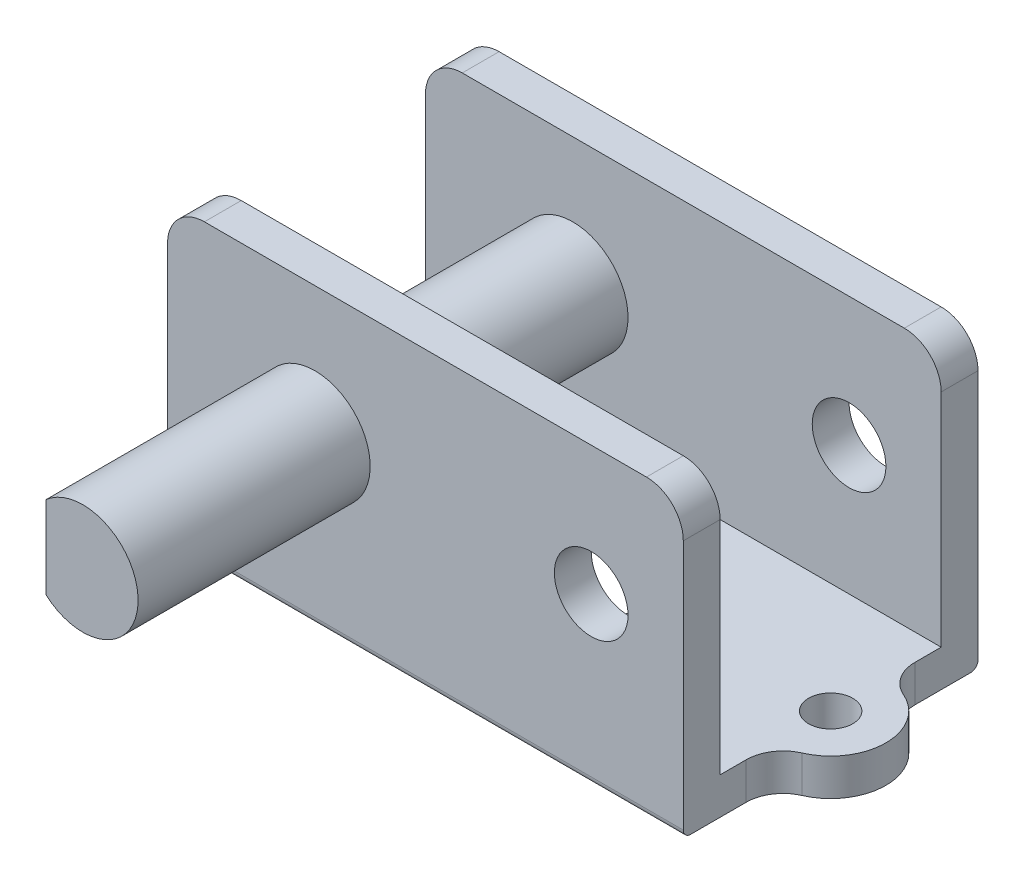
ISO-10303-21;
HEADER;
FILE_DESCRIPTION(('STEP AP214'),'2;1');
FILE_NAME('part.step','',(''),(''),'','','');
FILE_SCHEMA(('AUTOMOTIVE_DESIGN { 1 0 10303 214 1 1 1 1 }'));
ENDSEC;
DATA;
#1=APPLICATION_CONTEXT('core data for automotive mechanical design processes');
#2=APPLICATION_PROTOCOL_DEFINITION('international standard','automotive_design',2000,#1);
#3=PRODUCT_CONTEXT('',#1,'mechanical');
#4=PRODUCT('Part','Part','',(#3));
#5=PRODUCT_RELATED_PRODUCT_CATEGORY('part','',(#4));
#6=PRODUCT_DEFINITION_FORMATION('','',#4);
#7=PRODUCT_DEFINITION_CONTEXT('part definition',#1,'design');
#8=PRODUCT_DEFINITION('design','',#6,#7);
#9=PRODUCT_DEFINITION_SHAPE('','',#8);
#10=(LENGTH_UNIT() NAMED_UNIT(*) SI_UNIT(.MILLI.,.METRE.));
#11=(NAMED_UNIT(*) PLANE_ANGLE_UNIT() SI_UNIT($,.RADIAN.));
#12=(NAMED_UNIT(*) SI_UNIT($,.STERADIAN.) SOLID_ANGLE_UNIT());
#13=UNCERTAINTY_MEASURE_WITH_UNIT(LENGTH_MEASURE(1.E-05),#10,'distance_accuracy_value','');
#14=(GEOMETRIC_REPRESENTATION_CONTEXT(3) GLOBAL_UNCERTAINTY_ASSIGNED_CONTEXT((#13)) GLOBAL_UNIT_ASSIGNED_CONTEXT((#10,
#11,#12)) REPRESENTATION_CONTEXT('',''));
#15=CARTESIAN_POINT('',(0.,0.,0.));
#16=DIRECTION('',(0.,0.,1.));
#17=DIRECTION('',(1.,0.,0.));
#18=AXIS2_PLACEMENT_3D('',#15,#16,#17);
#19=CARTESIAN_POINT('',(-3.,4.5,-3.));
#20=DIRECTION('',(0.,0.,1.));
#21=DIRECTION('',(1.,0.,0.));
#22=AXIS2_PLACEMENT_3D('',#19,#20,#21);
#23=CYLINDRICAL_SURFACE('',#22,1.5);
#24=CARTESIAN_POINT('',(-3.,4.5,4.));
#25=DIRECTION('',(0.,0.,-1.));
#26=DIRECTION('',(-1.,0.,0.));
#27=AXIS2_PLACEMENT_3D('',#24,#25,#26);
#28=CIRCLE('',#27,1.5);
#29=CARTESIAN_POINT('',(-4.5,4.5,4.));
#30=VERTEX_POINT('',#29);
#31=EDGE_CURVE('E233',#30,#30,#28,.T.);
#32=ORIENTED_EDGE('',*,*,#31,.F.);
#33=EDGE_LOOP('',(#32));
#34=FACE_BOUND('',#33,.T.);
#35=DIRECTION('',(0.,0.,1.));
#36=VECTOR('',#35,1.);
#37=CARTESIAN_POINT('',(-4.,5.6180339887499,-3.));
#38=LINE('',#37,#36);
#39=CARTESIAN_POINT('',(-4.,5.6180339887499,10.3));
#40=VERTEX_POINT('',#39);
#41=CARTESIAN_POINT('',(-4.,5.6180339887499,5.));
#42=VERTEX_POINT('',#41);
#43=EDGE_CURVE('E217',#40,#42,#38,.F.);
#44=ORIENTED_EDGE('',*,*,#43,.F.);
#45=CARTESIAN_POINT('',(-3.,4.5,10.3));
#46=DIRECTION('',(0.,0.,1.));
#47=DIRECTION('',(1.,0.,0.));
#48=AXIS2_PLACEMENT_3D('',#45,#46,#47);
#49=CIRCLE('',#48,1.5);
#50=CARTESIAN_POINT('',(-4.,3.3819660112501,10.3));
#51=VERTEX_POINT('',#50);
#52=EDGE_CURVE('E64',#40,#51,#49,.F.);
#53=ORIENTED_EDGE('',*,*,#52,.T.);
#54=DIRECTION('',(0.,0.,1.));
#55=VECTOR('',#54,1.);
#56=CARTESIAN_POINT('',(-4.,3.3819660112501,-3.));
#57=LINE('',#56,#55);
#58=CARTESIAN_POINT('',(-4.,3.3819660112501,5.));
#59=VERTEX_POINT('',#58);
#60=EDGE_CURVE('E216',#59,#51,#57,.T.);
#61=ORIENTED_EDGE('',*,*,#60,.F.);
#62=CARTESIAN_POINT('',(-3.,4.5,5.));
#63=DIRECTION('',(0.,0.,1.));
#64=DIRECTION('',(1.,0.,0.));
#65=AXIS2_PLACEMENT_3D('',#62,#63,#64);
#66=CIRCLE('',#65,1.5);
#67=EDGE_CURVE('E363',#59,#42,#66,.F.);
#68=ORIENTED_EDGE('',*,*,#67,.T.);
#69=EDGE_LOOP('',(#44,#53,#61,#68));
#70=FACE_BOUND('',#69,.T.);
#71=ADVANCED_FACE('F51',(#34,#70),#23,.T.);
#72=CARTESIAN_POINT('',(-4.,0.,5.));
#73=DIRECTION('',(1.,0.,0.));
#74=DIRECTION('',(0.,0.,-1.));
#75=AXIS2_PLACEMENT_3D('',#72,#73,#74);
#76=PLANE('',#75);
#77=DIRECTION('',(0.,-1.,0.));
#78=VECTOR('',#77,1.);
#79=CARTESIAN_POINT('',(-4.,0.,10.3));
#80=LINE('',#79,#78);
#81=EDGE_CURVE('E13',#40,#51,#80,.T.);
#82=ORIENTED_EDGE('',*,*,#81,.F.);
#83=ORIENTED_EDGE('',*,*,#43,.T.);
#84=DIRECTION('',(0.,1.,0.));
#85=VECTOR('',#84,1.);
#86=CARTESIAN_POINT('',(-4.,0.,5.));
#87=LINE('',#86,#85);
#88=EDGE_CURVE('E223',#59,#42,#87,.T.);
#89=ORIENTED_EDGE('',*,*,#88,.F.);
#90=ORIENTED_EDGE('',*,*,#60,.T.);
#91=EDGE_LOOP('',(#82,#83,#89,#90));
#92=FACE_BOUND('',#91,.T.);
#93=ADVANCED_FACE('F221',(#92),#76,.F.);
#94=CARTESIAN_POINT('',(-7.,0.,4.));
#95=DIRECTION('',(1.,0.,0.));
#96=DIRECTION('',(0.,0.,-1.));
#97=AXIS2_PLACEMENT_3D('',#94,#95,#96);
#98=PLANE('',#97);
#99=DIRECTION('',(0.,0.,1.));
#100=VECTOR('',#99,1.);
#101=CARTESIAN_POINT('',(-7.,1.,0.));
#102=LINE('',#101,#100);
#103=CARTESIAN_POINT('',(-7.,1.,2.29128784747792));
#104=VERTEX_POINT('',#103);
#105=CARTESIAN_POINT('',(-7.,1.,3.));
#106=VERTEX_POINT('',#105);
#107=EDGE_CURVE('E249',#104,#106,#102,.T.);
#108=ORIENTED_EDGE('',*,*,#107,.F.);
#109=DIRECTION('',(0.,-1.,0.));
#110=VECTOR('',#109,1.);
#111=CARTESIAN_POINT('',(-7.,0.,2.29128784747792));
#112=LINE('',#111,#110);
#113=CARTESIAN_POINT('',(-7.,0.,2.29128784747792));
#114=VERTEX_POINT('',#113);
#115=EDGE_CURVE('E382',#104,#114,#112,.T.);
#116=ORIENTED_EDGE('',*,*,#115,.T.);
#117=DIRECTION('',(0.,0.,-1.));
#118=VECTOR('',#117,1.);
#119=CARTESIAN_POINT('',(-7.,0.,4.));
#120=LINE('',#119,#118);
#121=CARTESIAN_POINT('',(-7.,0.,3.8));
#122=VERTEX_POINT('',#121);
#123=EDGE_CURVE('E292',#122,#114,#120,.T.);
#124=ORIENTED_EDGE('',*,*,#123,.F.);
#125=CARTESIAN_POINT('',(-7.,0.199999999999999,3.8));
#126=DIRECTION('',(1.,0.,0.));
#127=DIRECTION('',(0.,0.,-1.));
#128=AXIS2_PLACEMENT_3D('',#125,#126,#127);
#129=CIRCLE('',#128,0.2);
#130=CARTESIAN_POINT('',(-7.,0.199999999999999,4.));
#131=VERTEX_POINT('',#130);
#132=EDGE_CURVE('E315',#122,#131,#129,.F.);
#133=ORIENTED_EDGE('',*,*,#132,.T.);
#134=DIRECTION('',(0.,-1.,0.));
#135=VECTOR('',#134,1.);
#136=CARTESIAN_POINT('',(-7.,0.,4.));
#137=LINE('',#136,#135);
#138=CARTESIAN_POINT('',(-7.,7.,4.));
#139=VERTEX_POINT('',#138);
#140=EDGE_CURVE('E283',#139,#131,#137,.T.);
#141=ORIENTED_EDGE('',*,*,#140,.F.);
#142=DIRECTION('',(0.,0.,-1.));
#143=VECTOR('',#142,1.);
#144=CARTESIAN_POINT('',(-7.,7.,4.));
#145=LINE('',#144,#143);
#146=CARTESIAN_POINT('',(-7.,7.,3.));
#147=VERTEX_POINT('',#146);
#148=EDGE_CURVE('E354',#139,#147,#145,.T.);
#149=ORIENTED_EDGE('',*,*,#148,.T.);
#150=DIRECTION('',(0.,1.,0.));
#151=VECTOR('',#150,1.);
#152=CARTESIAN_POINT('',(-7.,0.,3.));
#153=LINE('',#152,#151);
#154=EDGE_CURVE('E246',#106,#147,#153,.T.);
#155=ORIENTED_EDGE('',*,*,#154,.F.);
#156=EDGE_LOOP('',(#108,#116,#124,#133,#141,#149,#155));
#157=FACE_BOUND('',#156,.T.);
#158=ADVANCED_FACE('F406',(#157),#98,.F.);
#159=CARTESIAN_POINT('',(7.,8.,4.));
#160=DIRECTION('',(-1.,0.,0.));
#161=DIRECTION('',(0.,-1.,0.));
#162=AXIS2_PLACEMENT_3D('',#159,#160,#161);
#163=PLANE('',#162);
#164=DIRECTION('',(0.,0.,1.));
#165=VECTOR('',#164,1.);
#166=CARTESIAN_POINT('',(7.,1.,0.));
#167=LINE('',#166,#165);
#168=CARTESIAN_POINT('',(7.,1.,-3.));
#169=VERTEX_POINT('',#168);
#170=CARTESIAN_POINT('',(7.,1.,-2.29128784747792));
#171=VERTEX_POINT('',#170);
#172=EDGE_CURVE('E240',#169,#171,#167,.T.);
#173=ORIENTED_EDGE('',*,*,#172,.T.);
#174=DIRECTION('',(0.,1.,0.));
#175=VECTOR('',#174,1.);
#176=CARTESIAN_POINT('',(7.,0.,-2.29128784747792));
#177=LINE('',#176,#175);
#178=CARTESIAN_POINT('',(7.,0.,-2.29128784747792));
#179=VERTEX_POINT('',#178);
#180=EDGE_CURVE('E371',#171,#179,#177,.F.);
#181=ORIENTED_EDGE('',*,*,#180,.T.);
#182=DIRECTION('',(0.,0.,-1.));
#183=VECTOR('',#182,1.);
#184=CARTESIAN_POINT('',(7.,0.,4.));
#185=LINE('',#184,#183);
#186=CARTESIAN_POINT('',(7.,0.,-3.8));
#187=VERTEX_POINT('',#186);
#188=EDGE_CURVE('E295',#179,#187,#185,.T.);
#189=ORIENTED_EDGE('',*,*,#188,.T.);
#190=CARTESIAN_POINT('',(7.,0.200000000000001,-3.8));
#191=DIRECTION('',(-1.,0.,0.));
#192=DIRECTION('',(0.,-1.,0.));
#193=AXIS2_PLACEMENT_3D('',#190,#191,#192);
#194=CIRCLE('',#193,0.2);
#195=CARTESIAN_POINT('',(7.,0.200000000000001,-4.));
#196=VERTEX_POINT('',#195);
#197=EDGE_CURVE('E310',#187,#196,#194,.F.);
#198=ORIENTED_EDGE('',*,*,#197,.T.);
#199=DIRECTION('',(0.,1.,0.));
#200=VECTOR('',#199,1.);
#201=CARTESIAN_POINT('',(7.,8.,-4.));
#202=LINE('',#201,#200);
#203=CARTESIAN_POINT('',(7.,7.,-4.));
#204=VERTEX_POINT('',#203);
#205=EDGE_CURVE('E275',#196,#204,#202,.T.);
#206=ORIENTED_EDGE('',*,*,#205,.T.);
#207=DIRECTION('',(0.,0.,-1.));
#208=VECTOR('',#207,1.);
#209=CARTESIAN_POINT('',(7.,7.,4.));
#210=LINE('',#209,#208);
#211=CARTESIAN_POINT('',(7.,7.,-3.));
#212=VERTEX_POINT('',#211);
#213=EDGE_CURVE('E335',#204,#212,#210,.F.);
#214=ORIENTED_EDGE('',*,*,#213,.T.);
#215=DIRECTION('',(0.,1.,0.));
#216=VECTOR('',#215,1.);
#217=CARTESIAN_POINT('',(7.,0.,-3.));
#218=LINE('',#217,#216);
#219=EDGE_CURVE('E243',#169,#212,#218,.T.);
#220=ORIENTED_EDGE('',*,*,#219,.F.);
#221=EDGE_LOOP('',(#173,#181,#189,#198,#206,#214,#220));
#222=FACE_BOUND('',#221,.T.);
#223=ADVANCED_FACE('F483',(#222),#163,.F.);
#224=CARTESIAN_POINT('',(7.,0.,3.8));
#225=VERTEX_POINT('',#224);
#226=CARTESIAN_POINT('',(7.,0.,2.29128784747792));
#227=VERTEX_POINT('',#226);
#228=EDGE_CURVE('E296',#225,#227,#185,.T.);
#229=ORIENTED_EDGE('',*,*,#228,.T.);
#230=DIRECTION('',(0.,1.,0.));
#231=VECTOR('',#230,1.);
#232=CARTESIAN_POINT('',(7.,1.,2.29128784747792));
#233=LINE('',#232,#231);
#234=CARTESIAN_POINT('',(7.,1.,2.29128784747792));
#235=VERTEX_POINT('',#234);
#236=EDGE_CURVE('E373',#227,#235,#233,.T.);
#237=ORIENTED_EDGE('',*,*,#236,.T.);
#238=CARTESIAN_POINT('',(7.,1.,3.));
#239=VERTEX_POINT('',#238);
#240=EDGE_CURVE('E239',#235,#239,#167,.T.);
#241=ORIENTED_EDGE('',*,*,#240,.T.);
#242=DIRECTION('',(0.,1.,0.));
#243=VECTOR('',#242,1.);
#244=CARTESIAN_POINT('',(7.,0.,3.));
#245=LINE('',#244,#243);
#246=CARTESIAN_POINT('',(7.,7.,3.));
#247=VERTEX_POINT('',#246);
#248=EDGE_CURVE('E236',#239,#247,#245,.T.);
#249=ORIENTED_EDGE('',*,*,#248,.T.);
#250=DIRECTION('',(0.,0.,-1.));
#251=VECTOR('',#250,1.);
#252=CARTESIAN_POINT('',(7.,7.,4.));
#253=LINE('',#252,#251);
#254=CARTESIAN_POINT('',(7.,7.,4.));
#255=VERTEX_POINT('',#254);
#256=EDGE_CURVE('E333',#247,#255,#253,.F.);
#257=ORIENTED_EDGE('',*,*,#256,.T.);
#258=DIRECTION('',(0.,1.,0.));
#259=VECTOR('',#258,1.);
#260=CARTESIAN_POINT('',(7.,8.,4.));
#261=LINE('',#260,#259);
#262=CARTESIAN_POINT('',(7.,0.200000000000001,4.));
#263=VERTEX_POINT('',#262);
#264=EDGE_CURVE('E276',#263,#255,#261,.T.);
#265=ORIENTED_EDGE('',*,*,#264,.F.);
#266=CARTESIAN_POINT('',(7.,0.200000000000001,3.8));
#267=DIRECTION('',(-1.,0.,0.));
#268=DIRECTION('',(0.,-1.,0.));
#269=AXIS2_PLACEMENT_3D('',#266,#267,#268);
#270=CIRCLE('',#269,0.2);
#271=EDGE_CURVE('E308',#263,#225,#270,.F.);
#272=ORIENTED_EDGE('',*,*,#271,.T.);
#273=EDGE_LOOP('',(#229,#237,#241,#249,#257,#265,#272));
#274=FACE_BOUND('',#273,.T.);
#275=ADVANCED_FACE('F743',(#274),#163,.F.);
#276=CARTESIAN_POINT('',(-7.,8.,4.));
#277=DIRECTION('',(0.,-1.,0.));
#278=DIRECTION('',(0.,0.,-1.));
#279=AXIS2_PLACEMENT_3D('',#276,#277,#278);
#280=PLANE('',#279);
#281=DIRECTION('',(-1.,0.,0.));
#282=VECTOR('',#281,1.);
#283=CARTESIAN_POINT('',(-7.,8.,4.));
#284=LINE('',#283,#282);
#285=CARTESIAN_POINT('',(5.99999999999999,8.,4.));
#286=VERTEX_POINT('',#285);
#287=CARTESIAN_POINT('',(-6.,8.,4.));
#288=VERTEX_POINT('',#287);
#289=EDGE_CURVE('E279',#286,#288,#284,.T.);
#290=ORIENTED_EDGE('',*,*,#289,.F.);
#291=DIRECTION('',(0.,0.,-1.));
#292=VECTOR('',#291,1.);
#293=CARTESIAN_POINT('',(6.,8.,4.));
#294=LINE('',#293,#292);
#295=CARTESIAN_POINT('',(6.,8.,3.));
#296=VERTEX_POINT('',#295);
#297=EDGE_CURVE('E343',#286,#296,#294,.T.);
#298=ORIENTED_EDGE('',*,*,#297,.T.);
#299=DIRECTION('',(1.,0.,0.));
#300=VECTOR('',#299,1.);
#301=CARTESIAN_POINT('',(-7.,8.,3.));
#302=LINE('',#301,#300);
#303=CARTESIAN_POINT('',(-6.,8.,3.));
#304=VERTEX_POINT('',#303);
#305=EDGE_CURVE('E262',#304,#296,#302,.T.);
#306=ORIENTED_EDGE('',*,*,#305,.F.);
#307=DIRECTION('',(0.,0.,-1.));
#308=VECTOR('',#307,1.);
#309=CARTESIAN_POINT('',(-6.,8.,4.));
#310=LINE('',#309,#308);
#311=EDGE_CURVE('E341',#304,#288,#310,.F.);
#312=ORIENTED_EDGE('',*,*,#311,.T.);
#313=EDGE_LOOP('',(#290,#298,#306,#312));
#314=FACE_BOUND('',#313,.T.);
#315=ADVANCED_FACE('F750',(#314),#280,.F.);
#316=CARTESIAN_POINT('',(4.5,4.5,-4.));
#317=DIRECTION('',(0.,0.,1.));
#318=DIRECTION('',(1.,0.,0.));
#319=AXIS2_PLACEMENT_3D('',#316,#317,#318);
#320=CYLINDRICAL_SURFACE('',#319,1.);
#321=CARTESIAN_POINT('',(4.5,4.5,4.));
#322=DIRECTION('',(0.,0.,1.));
#323=DIRECTION('',(1.,0.,0.));
#324=AXIS2_PLACEMENT_3D('',#321,#322,#323);
#325=CIRCLE('',#324,1.);
#326=CARTESIAN_POINT('',(5.5,4.5,4.));
#327=VERTEX_POINT('',#326);
#328=EDGE_CURVE('E269',#327,#327,#325,.T.);
#329=ORIENTED_EDGE('',*,*,#328,.T.);
#330=EDGE_LOOP('',(#329));
#331=FACE_BOUND('',#330,.T.);
#332=CARTESIAN_POINT('',(4.5,4.5,3.));
#333=DIRECTION('',(0.,0.,-1.));
#334=DIRECTION('',(-1.,0.,0.));
#335=AXIS2_PLACEMENT_3D('',#332,#333,#334);
#336=CIRCLE('',#335,1.);
#337=CARTESIAN_POINT('',(3.5,4.5,3.));
#338=VERTEX_POINT('',#337);
#339=EDGE_CURVE('E259',#338,#338,#336,.F.);
#340=ORIENTED_EDGE('',*,*,#339,.F.);
#341=EDGE_LOOP('',(#340));
#342=FACE_BOUND('',#341,.T.);
#343=ADVANCED_FACE('F767',(#331,#342),#320,.F.);
#344=DIRECTION('',(1.,0.,0.));
#345=VECTOR('',#344,1.);
#346=CARTESIAN_POINT('',(-7.,8.,-3.));
#347=LINE('',#346,#345);
#348=CARTESIAN_POINT('',(-6.,8.,-3.));
#349=VERTEX_POINT('',#348);
#350=CARTESIAN_POINT('',(6.,8.,-3.));
#351=VERTEX_POINT('',#350);
#352=EDGE_CURVE('E266',#349,#351,#347,.T.);
#353=ORIENTED_EDGE('',*,*,#352,.T.);
#354=DIRECTION('',(0.,0.,-1.));
#355=VECTOR('',#354,1.);
#356=CARTESIAN_POINT('',(6.,8.,4.));
#357=LINE('',#356,#355);
#358=CARTESIAN_POINT('',(5.99999999999999,8.,-4.));
#359=VERTEX_POINT('',#358);
#360=EDGE_CURVE('E326',#351,#359,#357,.T.);
#361=ORIENTED_EDGE('',*,*,#360,.T.);
#362=DIRECTION('',(-1.,0.,0.));
#363=VECTOR('',#362,1.);
#364=CARTESIAN_POINT('',(-7.,8.,-4.));
#365=LINE('',#364,#363);
#366=CARTESIAN_POINT('',(-6.,8.,-4.));
#367=VERTEX_POINT('',#366);
#368=EDGE_CURVE('E288',#359,#367,#365,.T.);
#369=ORIENTED_EDGE('',*,*,#368,.T.);
#370=DIRECTION('',(0.,0.,-1.));
#371=VECTOR('',#370,1.);
#372=CARTESIAN_POINT('',(-6.,8.,4.));
#373=LINE('',#372,#371);
#374=EDGE_CURVE('E324',#367,#349,#373,.F.);
#375=ORIENTED_EDGE('',*,*,#374,.T.);
#376=EDGE_LOOP('',(#353,#361,#369,#375));
#377=FACE_BOUND('',#376,.T.);
#378=ADVANCED_FACE('F467',(#377),#280,.F.);
#379=CARTESIAN_POINT('',(-7.,0.,-2.29128784747792));
#380=VERTEX_POINT('',#379);
#381=CARTESIAN_POINT('',(-7.,0.,-3.8));
#382=VERTEX_POINT('',#381);
#383=EDGE_CURVE('E285',#380,#382,#120,.T.);
#384=ORIENTED_EDGE('',*,*,#383,.F.);
#385=DIRECTION('',(0.,-1.,0.));
#386=VECTOR('',#385,1.);
#387=CARTESIAN_POINT('',(-7.,0.,-2.29128784747792));
#388=LINE('',#387,#386);
#389=CARTESIAN_POINT('',(-7.,1.,-2.29128784747792));
#390=VERTEX_POINT('',#389);
#391=EDGE_CURVE('E375',#380,#390,#388,.F.);
#392=ORIENTED_EDGE('',*,*,#391,.T.);
#393=CARTESIAN_POINT('',(-7.,1.,-3.));
#394=VERTEX_POINT('',#393);
#395=EDGE_CURVE('E250',#394,#390,#102,.T.);
#396=ORIENTED_EDGE('',*,*,#395,.F.);
#397=DIRECTION('',(0.,1.,0.));
#398=VECTOR('',#397,1.);
#399=CARTESIAN_POINT('',(-7.,0.,-3.));
#400=LINE('',#399,#398);
#401=CARTESIAN_POINT('',(-7.,7.,-3.));
#402=VERTEX_POINT('',#401);
#403=EDGE_CURVE('E253',#394,#402,#400,.T.);
#404=ORIENTED_EDGE('',*,*,#403,.T.);
#405=DIRECTION('',(0.,0.,-1.));
#406=VECTOR('',#405,1.);
#407=CARTESIAN_POINT('',(-7.,7.,4.));
#408=LINE('',#407,#406);
#409=CARTESIAN_POINT('',(-7.,7.,-4.));
#410=VERTEX_POINT('',#409);
#411=EDGE_CURVE('E357',#402,#410,#408,.T.);
#412=ORIENTED_EDGE('',*,*,#411,.T.);
#413=DIRECTION('',(0.,-1.,0.));
#414=VECTOR('',#413,1.);
#415=CARTESIAN_POINT('',(-7.,0.,-4.));
#416=LINE('',#415,#414);
#417=CARTESIAN_POINT('',(-7.,0.199999999999999,-4.));
#418=VERTEX_POINT('',#417);
#419=EDGE_CURVE('E280',#410,#418,#416,.T.);
#420=ORIENTED_EDGE('',*,*,#419,.T.);
#421=CARTESIAN_POINT('',(-7.,0.199999999999999,-3.8));
#422=DIRECTION('',(1.,0.,0.));
#423=DIRECTION('',(0.,0.,-1.));
#424=AXIS2_PLACEMENT_3D('',#421,#422,#423);
#425=CIRCLE('',#424,0.2);
#426=EDGE_CURVE('E318',#418,#382,#425,.F.);
#427=ORIENTED_EDGE('',*,*,#426,.T.);
#428=EDGE_LOOP('',(#384,#392,#396,#404,#412,#420,#427));
#429=FACE_BOUND('',#428,.T.);
#430=ADVANCED_FACE('F478',(#429),#98,.F.);
#431=CARTESIAN_POINT('',(0.,0.,4.));
#432=DIRECTION('',(0.,1.,0.));
#433=DIRECTION('',(-1.,0.,0.));
#434=AXIS2_PLACEMENT_3D('',#431,#432,#433);
#435=PLANE('',#434);
#436=CARTESIAN_POINT('',(0.,0.,0.));
#437=DIRECTION('',(0.,-1.,0.));
#438=DIRECTION('',(1.,0.,0.));
#439=AXIS2_PLACEMENT_3D('',#436,#437,#438);
#440=CIRCLE('',#439,2.);
#441=CARTESIAN_POINT('',(2.,0.,0.));
#442=VERTEX_POINT('',#441);
#443=EDGE_CURVE('E218',#442,#442,#440,.T.);
#444=ORIENTED_EDGE('',*,*,#443,.F.);
#445=EDGE_LOOP('',(#444));
#446=FACE_BOUND('',#445,.T.);
#447=CARTESIAN_POINT('',(-7.,0.,0.));
#448=DIRECTION('',(0.,-1.,0.));
#449=DIRECTION('',(1.,0.,0.));
#450=AXIS2_PLACEMENT_3D('',#447,#448,#449);
#451=CIRCLE('',#450,0.6);
#452=CARTESIAN_POINT('',(-6.4,0.,0.));
#453=VERTEX_POINT('',#452);
#454=EDGE_CURVE('E511',#453,#453,#451,.T.);
#455=ORIENTED_EDGE('',*,*,#454,.F.);
#456=EDGE_LOOP('',(#455));
#457=FACE_BOUND('',#456,.T.);
#458=CARTESIAN_POINT('',(7.,0.,0.));
#459=DIRECTION('',(0.,-1.,0.));
#460=DIRECTION('',(1.,0.,0.));
#461=AXIS2_PLACEMENT_3D('',#458,#459,#460);
#462=CIRCLE('',#461,0.6);
#463=CARTESIAN_POINT('',(7.6,0.,0.));
#464=VERTEX_POINT('',#463);
#465=EDGE_CURVE('E504',#464,#464,#462,.T.);
#466=ORIENTED_EDGE('',*,*,#465,.F.);
#467=EDGE_LOOP('',(#466));
#468=FACE_BOUND('',#467,.T.);
#469=ORIENTED_EDGE('',*,*,#123,.T.);
#470=CARTESIAN_POINT('',(-8.,0.,2.29128784747792));
#471=DIRECTION('',(0.,1.,0.));
#472=DIRECTION('',(-1.,0.,0.));
#473=AXIS2_PLACEMENT_3D('',#470,#471,#472);
#474=CIRCLE('',#473,1.);
#475=CARTESIAN_POINT('',(-7.6,0.,1.37477270848675));
#476=VERTEX_POINT('',#475);
#477=EDGE_CURVE('E72',#114,#476,#474,.T.);
#478=ORIENTED_EDGE('',*,*,#477,.T.);
#479=CARTESIAN_POINT('',(-7.,0.,0.));
#480=DIRECTION('',(0.,-1.,0.));
#481=DIRECTION('',(1.,0.,0.));
#482=AXIS2_PLACEMENT_3D('',#479,#480,#481);
#483=CIRCLE('',#482,1.5);
#484=CARTESIAN_POINT('',(-7.6,0.,-1.37477270848675));
#485=VERTEX_POINT('',#484);
#486=EDGE_CURVE('E498',#476,#485,#483,.T.);
#487=ORIENTED_EDGE('',*,*,#486,.T.);
#488=CARTESIAN_POINT('',(-8.,0.,-2.29128784747792));
#489=DIRECTION('',(0.,1.,0.));
#490=DIRECTION('',(-1.,0.,0.));
#491=AXIS2_PLACEMENT_3D('',#488,#489,#490);
#492=CIRCLE('',#491,1.);
#493=EDGE_CURVE('E394',#485,#380,#492,.T.);
#494=ORIENTED_EDGE('',*,*,#493,.T.);
#495=ORIENTED_EDGE('',*,*,#383,.T.);
#496=DIRECTION('',(1.,0.,0.));
#497=VECTOR('',#496,1.);
#498=CARTESIAN_POINT('',(7.,0.,-3.8));
#499=LINE('',#498,#497);
#500=EDGE_CURVE('E305',#382,#187,#499,.T.);
#501=ORIENTED_EDGE('',*,*,#500,.T.);
#502=ORIENTED_EDGE('',*,*,#188,.F.);
#503=CARTESIAN_POINT('',(8.,0.,-2.29128784747792));
#504=DIRECTION('',(0.,1.,0.));
#505=DIRECTION('',(-1.,0.,0.));
#506=AXIS2_PLACEMENT_3D('',#503,#504,#505);
#507=CIRCLE('',#506,1.);
#508=CARTESIAN_POINT('',(7.6,0.,-1.37477270848675));
#509=VERTEX_POINT('',#508);
#510=EDGE_CURVE('E386',#179,#509,#507,.T.);
#511=ORIENTED_EDGE('',*,*,#510,.T.);
#512=CARTESIAN_POINT('',(7.,0.,0.));
#513=DIRECTION('',(0.,-1.,0.));
#514=DIRECTION('',(1.,0.,0.));
#515=AXIS2_PLACEMENT_3D('',#512,#513,#514);
#516=CIRCLE('',#515,1.5);
#517=CARTESIAN_POINT('',(7.6,0.,1.37477270848675));
#518=VERTEX_POINT('',#517);
#519=EDGE_CURVE('E493',#518,#509,#516,.F.);
#520=ORIENTED_EDGE('',*,*,#519,.F.);
#521=CARTESIAN_POINT('',(8.,0.,2.29128784747792));
#522=DIRECTION('',(0.,1.,0.));
#523=DIRECTION('',(-1.,0.,0.));
#524=AXIS2_PLACEMENT_3D('',#521,#522,#523);
#525=CIRCLE('',#524,1.);
#526=EDGE_CURVE('E388',#518,#227,#525,.T.);
#527=ORIENTED_EDGE('',*,*,#526,.T.);
#528=ORIENTED_EDGE('',*,*,#228,.F.);
#529=DIRECTION('',(1.,0.,0.));
#530=VECTOR('',#529,1.);
#531=CARTESIAN_POINT('',(0.,0.,3.8));
#532=LINE('',#531,#530);
#533=EDGE_CURVE('E299',#225,#122,#532,.F.);
#534=ORIENTED_EDGE('',*,*,#533,.T.);
#535=EDGE_LOOP('',(#469,#478,#487,#494,#495,#501,#502,#511,#520,#527,#528,#534));
#536=FACE_BOUND('',#535,.T.);
#537=ADVANCED_FACE('F492',(#446,#457,#468,#536),#435,.F.);
#538=CARTESIAN_POINT('',(0.,0.,4.));
#539=DIRECTION('',(0.,0.,-1.));
#540=DIRECTION('',(-1.,0.,0.));
#541=AXIS2_PLACEMENT_3D('',#538,#539,#540);
#542=PLANE('',#541);
#543=ORIENTED_EDGE('',*,*,#31,.T.);
#544=EDGE_LOOP('',(#543));
#545=FACE_BOUND('',#544,.T.);
#546=ORIENTED_EDGE('',*,*,#328,.F.);
#547=EDGE_LOOP('',(#546));
#548=FACE_BOUND('',#547,.T.);
#549=ORIENTED_EDGE('',*,*,#264,.T.);
#550=CARTESIAN_POINT('',(6.,7.,4.));
#551=DIRECTION('',(0.,0.,-1.));
#552=DIRECTION('',(-1.,0.,0.));
#553=AXIS2_PLACEMENT_3D('',#550,#551,#552);
#554=CIRCLE('',#553,1.);
#555=EDGE_CURVE('E352',#255,#286,#554,.F.);
#556=ORIENTED_EDGE('',*,*,#555,.T.);
#557=ORIENTED_EDGE('',*,*,#289,.T.);
#558=CARTESIAN_POINT('',(-6.,7.,4.));
#559=DIRECTION('',(0.,0.,-1.));
#560=DIRECTION('',(-1.,0.,0.));
#561=AXIS2_PLACEMENT_3D('',#558,#559,#560);
#562=CIRCLE('',#561,1.);
#563=EDGE_CURVE('E350',#288,#139,#562,.F.);
#564=ORIENTED_EDGE('',*,*,#563,.T.);
#565=ORIENTED_EDGE('',*,*,#140,.T.);
#566=DIRECTION('',(1.,0.,0.));
#567=VECTOR('',#566,1.);
#568=CARTESIAN_POINT('',(0.,0.2,4.));
#569=LINE('',#568,#567);
#570=EDGE_CURVE('E321',#131,#263,#569,.T.);
#571=ORIENTED_EDGE('',*,*,#570,.T.);
#572=EDGE_LOOP('',(#549,#556,#557,#564,#565,#571));
#573=FACE_BOUND('',#572,.T.);
#574=ADVANCED_FACE('F527',(#545,#548,#573),#542,.F.);
#575=CARTESIAN_POINT('',(0.,0.,-4.));
#576=DIRECTION('',(0.,0.,-1.));
#577=DIRECTION('',(-1.,0.,0.));
#578=AXIS2_PLACEMENT_3D('',#575,#576,#577);
#579=PLANE('',#578);
#580=CARTESIAN_POINT('',(4.5,4.5,-4.));
#581=DIRECTION('',(0.,0.,1.));
#582=DIRECTION('',(1.,0.,0.));
#583=AXIS2_PLACEMENT_3D('',#580,#581,#582);
#584=CIRCLE('',#583,1.);
#585=CARTESIAN_POINT('',(5.5,4.5,-4.));
#586=VERTEX_POINT('',#585);
#587=EDGE_CURVE('E272',#586,#586,#584,.T.);
#588=ORIENTED_EDGE('',*,*,#587,.T.);
#589=EDGE_LOOP('',(#588));
#590=FACE_BOUND('',#589,.T.);
#591=ORIENTED_EDGE('',*,*,#368,.F.);
#592=CARTESIAN_POINT('',(6.,7.,-4.));
#593=DIRECTION('',(0.,0.,-1.));
#594=DIRECTION('',(-1.,0.,0.));
#595=AXIS2_PLACEMENT_3D('',#592,#593,#594);
#596=CIRCLE('',#595,1.);
#597=EDGE_CURVE('E331',#359,#204,#596,.T.);
#598=ORIENTED_EDGE('',*,*,#597,.T.);
#599=ORIENTED_EDGE('',*,*,#205,.F.);
#600=DIRECTION('',(1.,0.,0.));
#601=VECTOR('',#600,1.);
#602=CARTESIAN_POINT('',(-7.,0.199999999999999,-4.));
#603=LINE('',#602,#601);
#604=EDGE_CURVE('E312',#196,#418,#603,.F.);
#605=ORIENTED_EDGE('',*,*,#604,.T.);
#606=ORIENTED_EDGE('',*,*,#419,.F.);
#607=CARTESIAN_POINT('',(-6.,7.,-4.));
#608=DIRECTION('',(0.,0.,-1.));
#609=DIRECTION('',(-1.,0.,0.));
#610=AXIS2_PLACEMENT_3D('',#607,#608,#609);
#611=CIRCLE('',#610,1.);
#612=EDGE_CURVE('E329',#410,#367,#611,.T.);
#613=ORIENTED_EDGE('',*,*,#612,.T.);
#614=EDGE_LOOP('',(#591,#598,#599,#605,#606,#613));
#615=FACE_BOUND('',#614,.T.);
#616=ADVANCED_FACE('F470',(#590,#615),#579,.T.);
#617=CARTESIAN_POINT('',(4.5,4.5,-3.));
#618=DIRECTION('',(0.,0.,-1.));
#619=DIRECTION('',(-1.,0.,0.));
#620=AXIS2_PLACEMENT_3D('',#617,#618,#619);
#621=CIRCLE('',#620,1.);
#622=CARTESIAN_POINT('',(3.5,4.5,-3.));
#623=VERTEX_POINT('',#622);
#624=EDGE_CURVE('E265',#623,#623,#621,.F.);
#625=ORIENTED_EDGE('',*,*,#624,.T.);
#626=EDGE_LOOP('',(#625));
#627=FACE_BOUND('',#626,.T.);
#628=ORIENTED_EDGE('',*,*,#587,.F.);
#629=EDGE_LOOP('',(#628));
#630=FACE_BOUND('',#629,.T.);
#631=ADVANCED_FACE('F452',(#627,#630),#320,.F.);
#632=CARTESIAN_POINT('',(-7.,0.,-3.));
#633=DIRECTION('',(0.,0.,-1.));
#634=DIRECTION('',(-1.,0.,0.));
#635=AXIS2_PLACEMENT_3D('',#632,#633,#634);
#636=PLANE('',#635);
#637=CARTESIAN_POINT('',(-3.,4.5,-3.));
#638=DIRECTION('',(0.,0.,1.));
#639=DIRECTION('',(1.,0.,0.));
#640=AXIS2_PLACEMENT_3D('',#637,#638,#639);
#641=CIRCLE('',#640,1.5);
#642=CARTESIAN_POINT('',(-1.5,4.5,-3.));
#643=VERTEX_POINT('',#642);
#644=EDGE_CURVE('E225',#643,#643,#641,.T.);
#645=ORIENTED_EDGE('',*,*,#644,.F.);
#646=EDGE_LOOP('',(#645));
#647=FACE_BOUND('',#646,.T.);
#648=ORIENTED_EDGE('',*,*,#624,.F.);
#649=EDGE_LOOP('',(#648));
#650=FACE_BOUND('',#649,.T.);
#651=ORIENTED_EDGE('',*,*,#219,.T.);
#652=CARTESIAN_POINT('',(6.,7.,-3.));
#653=DIRECTION('',(0.,0.,-1.));
#654=DIRECTION('',(-1.,0.,0.));
#655=AXIS2_PLACEMENT_3D('',#652,#653,#654);
#656=CIRCLE('',#655,1.);
#657=EDGE_CURVE('E339',#212,#351,#656,.F.);
#658=ORIENTED_EDGE('',*,*,#657,.T.);
#659=ORIENTED_EDGE('',*,*,#352,.F.);
#660=CARTESIAN_POINT('',(-6.,7.,-3.));
#661=DIRECTION('',(0.,0.,-1.));
#662=DIRECTION('',(-1.,0.,0.));
#663=AXIS2_PLACEMENT_3D('',#660,#661,#662);
#664=CIRCLE('',#663,1.);
#665=EDGE_CURVE('E337',#349,#402,#664,.F.);
#666=ORIENTED_EDGE('',*,*,#665,.T.);
#667=ORIENTED_EDGE('',*,*,#403,.F.);
#668=DIRECTION('',(1.,0.,0.));
#669=VECTOR('',#668,1.);
#670=CARTESIAN_POINT('',(-7.,1.,-3.));
#671=LINE('',#670,#669);
#672=EDGE_CURVE('E257',#394,#169,#671,.T.);
#673=ORIENTED_EDGE('',*,*,#672,.T.);
#674=EDGE_LOOP('',(#651,#658,#659,#666,#667,#673));
#675=FACE_BOUND('',#674,.T.);
#676=ADVANCED_FACE('F448',(#647,#650,#675),#636,.F.);
#677=CARTESIAN_POINT('',(-7.,0.,3.));
#678=DIRECTION('',(0.,0.,-1.));
#679=DIRECTION('',(-1.,0.,0.));
#680=AXIS2_PLACEMENT_3D('',#677,#678,#679);
#681=PLANE('',#680);
#682=CARTESIAN_POINT('',(-3.,4.5,3.));
#683=DIRECTION('',(0.,0.,-1.));
#684=DIRECTION('',(-1.,0.,0.));
#685=AXIS2_PLACEMENT_3D('',#682,#683,#684);
#686=CIRCLE('',#685,1.5);
#687=CARTESIAN_POINT('',(-4.5,4.5,3.));
#688=VERTEX_POINT('',#687);
#689=EDGE_CURVE('E360',#688,#688,#686,.T.);
#690=ORIENTED_EDGE('',*,*,#689,.F.);
#691=EDGE_LOOP('',(#690));
#692=FACE_BOUND('',#691,.T.);
#693=ORIENTED_EDGE('',*,*,#339,.T.);
#694=EDGE_LOOP('',(#693));
#695=FACE_BOUND('',#694,.T.);
#696=ORIENTED_EDGE('',*,*,#305,.T.);
#697=CARTESIAN_POINT('',(6.,7.,3.));
#698=DIRECTION('',(0.,0.,-1.));
#699=DIRECTION('',(-1.,0.,0.));
#700=AXIS2_PLACEMENT_3D('',#697,#698,#699);
#701=CIRCLE('',#700,1.);
#702=EDGE_CURVE('E348',#296,#247,#701,.T.);
#703=ORIENTED_EDGE('',*,*,#702,.T.);
#704=ORIENTED_EDGE('',*,*,#248,.F.);
#705=DIRECTION('',(1.,0.,0.));
#706=VECTOR('',#705,1.);
#707=CARTESIAN_POINT('',(-7.,1.,3.));
#708=LINE('',#707,#706);
#709=EDGE_CURVE('E256',#106,#239,#708,.T.);
#710=ORIENTED_EDGE('',*,*,#709,.F.);
#711=ORIENTED_EDGE('',*,*,#154,.T.);
#712=CARTESIAN_POINT('',(-6.,7.,3.));
#713=DIRECTION('',(0.,0.,-1.));
#714=DIRECTION('',(-1.,0.,0.));
#715=AXIS2_PLACEMENT_3D('',#712,#713,#714);
#716=CIRCLE('',#715,1.);
#717=EDGE_CURVE('E346',#147,#304,#716,.T.);
#718=ORIENTED_EDGE('',*,*,#717,.T.);
#719=EDGE_LOOP('',(#696,#703,#704,#710,#711,#718));
#720=FACE_BOUND('',#719,.T.);
#721=ADVANCED_FACE('F451',(#692,#695,#720),#681,.T.);
#722=CARTESIAN_POINT('',(-7.,1.,0.));
#723=DIRECTION('',(0.,1.,0.));
#724=DIRECTION('',(0.,0.,1.));
#725=AXIS2_PLACEMENT_3D('',#722,#723,#724);
#726=PLANE('',#725);
#727=CARTESIAN_POINT('',(0.,1.,0.));
#728=DIRECTION('',(0.,-1.,0.));
#729=DIRECTION('',(1.,0.,0.));
#730=AXIS2_PLACEMENT_3D('',#727,#728,#729);
#731=CIRCLE('',#730,2.);
#732=CARTESIAN_POINT('',(2.,1.,0.));
#733=VERTEX_POINT('',#732);
#734=EDGE_CURVE('E508',#733,#733,#731,.T.);
#735=ORIENTED_EDGE('',*,*,#734,.T.);
#736=EDGE_LOOP('',(#735));
#737=FACE_BOUND('',#736,.T.);
#738=CARTESIAN_POINT('',(-7.,0.999999999999999,0.));
#739=DIRECTION('',(0.,-1.,0.));
#740=DIRECTION('',(1.,0.,0.));
#741=AXIS2_PLACEMENT_3D('',#738,#739,#740);
#742=CIRCLE('',#741,0.6);
#743=CARTESIAN_POINT('',(-6.4,0.999999999999999,0.));
#744=VERTEX_POINT('',#743);
#745=EDGE_CURVE('E502',#744,#744,#742,.T.);
#746=ORIENTED_EDGE('',*,*,#745,.T.);
#747=EDGE_LOOP('',(#746));
#748=FACE_BOUND('',#747,.T.);
#749=CARTESIAN_POINT('',(7.,1.,0.));
#750=DIRECTION('',(0.,-1.,0.));
#751=DIRECTION('',(1.,0.,0.));
#752=AXIS2_PLACEMENT_3D('',#749,#750,#751);
#753=CIRCLE('',#752,0.6);
#754=CARTESIAN_POINT('',(7.6,1.,0.));
#755=VERTEX_POINT('',#754);
#756=EDGE_CURVE('E507',#755,#755,#753,.T.);
#757=ORIENTED_EDGE('',*,*,#756,.T.);
#758=EDGE_LOOP('',(#757));
#759=FACE_BOUND('',#758,.T.);
#760=ORIENTED_EDGE('',*,*,#395,.T.);
#761=CARTESIAN_POINT('',(-8.,1.,-2.29128784747792));
#762=DIRECTION('',(0.,1.,0.));
#763=DIRECTION('',(0.,0.,1.));
#764=AXIS2_PLACEMENT_3D('',#761,#762,#763);
#765=CIRCLE('',#764,1.);
#766=CARTESIAN_POINT('',(-7.6,0.999999999999999,-1.37477270848675));
#767=VERTEX_POINT('',#766);
#768=EDGE_CURVE('E392',#390,#767,#765,.F.);
#769=ORIENTED_EDGE('',*,*,#768,.T.);
#770=CARTESIAN_POINT('',(-7.,0.999999999999999,0.));
#771=DIRECTION('',(0.,-1.,0.));
#772=DIRECTION('',(1.,0.,0.));
#773=AXIS2_PLACEMENT_3D('',#770,#771,#772);
#774=CIRCLE('',#773,1.5);
#775=CARTESIAN_POINT('',(-7.6,0.999999999999999,1.37477270848675));
#776=VERTEX_POINT('',#775);
#777=EDGE_CURVE('E403',#776,#767,#774,.T.);
#778=ORIENTED_EDGE('',*,*,#777,.F.);
#779=CARTESIAN_POINT('',(-8.,1.,2.29128784747792));
#780=DIRECTION('',(0.,1.,0.));
#781=DIRECTION('',(0.,0.,1.));
#782=AXIS2_PLACEMENT_3D('',#779,#780,#781);
#783=CIRCLE('',#782,1.);
#784=EDGE_CURVE('E59',#776,#104,#783,.F.);
#785=ORIENTED_EDGE('',*,*,#784,.T.);
#786=ORIENTED_EDGE('',*,*,#107,.T.);
#787=ORIENTED_EDGE('',*,*,#709,.T.);
#788=ORIENTED_EDGE('',*,*,#240,.F.);
#789=CARTESIAN_POINT('',(8.,1.,2.29128784747792));
#790=DIRECTION('',(0.,1.,0.));
#791=DIRECTION('',(0.,0.,1.));
#792=AXIS2_PLACEMENT_3D('',#789,#790,#791);
#793=CIRCLE('',#792,1.);
#794=CARTESIAN_POINT('',(7.6,1.,1.37477270848675));
#795=VERTEX_POINT('',#794);
#796=EDGE_CURVE('E390',#235,#795,#793,.F.);
#797=ORIENTED_EDGE('',*,*,#796,.T.);
#798=CARTESIAN_POINT('',(7.,1.,0.));
#799=DIRECTION('',(0.,-1.,0.));
#800=DIRECTION('',(1.,0.,0.));
#801=AXIS2_PLACEMENT_3D('',#798,#799,#800);
#802=CIRCLE('',#801,1.5);
#803=CARTESIAN_POINT('',(7.6,1.,-1.37477270848675));
#804=VERTEX_POINT('',#803);
#805=EDGE_CURVE('E227',#795,#804,#802,.F.);
#806=ORIENTED_EDGE('',*,*,#805,.T.);
#807=CARTESIAN_POINT('',(8.,1.,-2.29128784747792));
#808=DIRECTION('',(0.,1.,0.));
#809=DIRECTION('',(0.,0.,1.));
#810=AXIS2_PLACEMENT_3D('',#807,#808,#809);
#811=CIRCLE('',#810,1.);
#812=EDGE_CURVE('E384',#804,#171,#811,.F.);
#813=ORIENTED_EDGE('',*,*,#812,.T.);
#814=ORIENTED_EDGE('',*,*,#172,.F.);
#815=ORIENTED_EDGE('',*,*,#672,.F.);
#816=EDGE_LOOP('',(#760,#769,#778,#785,#786,#787,#788,#797,#806,#813,#814,#815));
#817=FACE_BOUND('',#816,.T.);
#818=ADVANCED_FACE('F400',(#737,#748,#759,#817),#726,.T.);
#819=CARTESIAN_POINT('',(0.,0.2,-3.8));
#820=DIRECTION('',(-1.,0.,0.));
#821=DIRECTION('',(0.,-1.,0.));
#822=AXIS2_PLACEMENT_3D('',#819,#820,#821);
#823=CYLINDRICAL_SURFACE('',#822,0.2);
#824=ORIENTED_EDGE('',*,*,#426,.F.);
#825=ORIENTED_EDGE('',*,*,#604,.F.);
#826=ORIENTED_EDGE('',*,*,#197,.F.);
#827=ORIENTED_EDGE('',*,*,#500,.F.);
#828=EDGE_LOOP('',(#824,#825,#826,#827));
#829=FACE_BOUND('',#828,.T.);
#830=ADVANCED_FACE('F607',(#829),#823,.T.);
#831=CARTESIAN_POINT('',(0.,0.2,3.8));
#832=DIRECTION('',(1.,0.,0.));
#833=DIRECTION('',(0.,1.,0.));
#834=AXIS2_PLACEMENT_3D('',#831,#832,#833);
#835=CYLINDRICAL_SURFACE('',#834,0.2);
#836=ORIENTED_EDGE('',*,*,#132,.F.);
#837=ORIENTED_EDGE('',*,*,#533,.F.);
#838=ORIENTED_EDGE('',*,*,#271,.F.);
#839=ORIENTED_EDGE('',*,*,#570,.F.);
#840=EDGE_LOOP('',(#836,#837,#838,#839));
#841=FACE_BOUND('',#840,.T.);
#842=ADVANCED_FACE('F645',(#841),#835,.T.);
#843=CARTESIAN_POINT('',(6.,7.,4.));
#844=DIRECTION('',(0.,0.,-1.));
#845=DIRECTION('',(-1.,0.,0.));
#846=AXIS2_PLACEMENT_3D('',#843,#844,#845);
#847=CYLINDRICAL_SURFACE('',#846,1.);
#848=ORIENTED_EDGE('',*,*,#657,.F.);
#849=ORIENTED_EDGE('',*,*,#213,.F.);
#850=ORIENTED_EDGE('',*,*,#597,.F.);
#851=ORIENTED_EDGE('',*,*,#360,.F.);
#852=EDGE_LOOP('',(#848,#849,#850,#851));
#853=FACE_BOUND('',#852,.T.);
#854=ADVANCED_FACE('F464',(#853),#847,.T.);
#855=CARTESIAN_POINT('',(6.,7.,4.));
#856=DIRECTION('',(0.,0.,-1.));
#857=DIRECTION('',(-1.,0.,0.));
#858=AXIS2_PLACEMENT_3D('',#855,#856,#857);
#859=CYLINDRICAL_SURFACE('',#858,1.);
#860=ORIENTED_EDGE('',*,*,#555,.F.);
#861=ORIENTED_EDGE('',*,*,#256,.F.);
#862=ORIENTED_EDGE('',*,*,#702,.F.);
#863=ORIENTED_EDGE('',*,*,#297,.F.);
#864=EDGE_LOOP('',(#860,#861,#862,#863));
#865=FACE_BOUND('',#864,.T.);
#866=ADVANCED_FACE('F662',(#865),#859,.T.);
#867=CARTESIAN_POINT('',(-6.,7.,4.));
#868=DIRECTION('',(0.,0.,-1.));
#869=DIRECTION('',(-1.,0.,0.));
#870=AXIS2_PLACEMENT_3D('',#867,#868,#869);
#871=CYLINDRICAL_SURFACE('',#870,1.);
#872=ORIENTED_EDGE('',*,*,#665,.F.);
#873=ORIENTED_EDGE('',*,*,#374,.F.);
#874=ORIENTED_EDGE('',*,*,#612,.F.);
#875=ORIENTED_EDGE('',*,*,#411,.F.);
#876=EDGE_LOOP('',(#872,#873,#874,#875));
#877=FACE_BOUND('',#876,.T.);
#878=ADVANCED_FACE('F441',(#877),#871,.T.);
#879=CARTESIAN_POINT('',(-6.,7.,4.));
#880=DIRECTION('',(0.,0.,-1.));
#881=DIRECTION('',(-1.,0.,0.));
#882=AXIS2_PLACEMENT_3D('',#879,#880,#881);
#883=CYLINDRICAL_SURFACE('',#882,1.);
#884=ORIENTED_EDGE('',*,*,#563,.F.);
#885=ORIENTED_EDGE('',*,*,#311,.F.);
#886=ORIENTED_EDGE('',*,*,#717,.F.);
#887=ORIENTED_EDGE('',*,*,#148,.F.);
#888=EDGE_LOOP('',(#884,#885,#886,#887));
#889=FACE_BOUND('',#888,.T.);
#890=ADVANCED_FACE('F432',(#889),#883,.T.);
#891=ORIENTED_EDGE('',*,*,#689,.T.);
#892=EDGE_LOOP('',(#891));
#893=FACE_BOUND('',#892,.T.);
#894=ORIENTED_EDGE('',*,*,#644,.T.);
#895=EDGE_LOOP('',(#894));
#896=FACE_BOUND('',#895,.T.);
#897=ADVANCED_FACE('F422',(#893,#896),#23,.T.);
#898=CARTESIAN_POINT('',(0.,0.,5.));
#899=DIRECTION('',(0.,0.,1.));
#900=DIRECTION('',(1.,0.,0.));
#901=AXIS2_PLACEMENT_3D('',#898,#899,#900);
#902=PLANE('',#901);
#903=ORIENTED_EDGE('',*,*,#88,.T.);
#904=ORIENTED_EDGE('',*,*,#67,.F.);
#905=EDGE_LOOP('',(#903,#904));
#906=FACE_BOUND('',#905,.T.);
#907=ADVANCED_FACE('F431',(#906),#902,.T.);
#908=CARTESIAN_POINT('',(7.,1.,0.));
#909=DIRECTION('',(0.,-1.,0.));
#910=DIRECTION('',(1.,0.,0.));
#911=AXIS2_PLACEMENT_3D('',#908,#909,#910);
#912=CYLINDRICAL_SURFACE('',#911,1.5);
#913=ORIENTED_EDGE('',*,*,#519,.T.);
#914=DIRECTION('',(0.,-1.,0.));
#915=VECTOR('',#914,1.);
#916=CARTESIAN_POINT('',(7.6,1.,-1.37477270848675));
#917=LINE('',#916,#915);
#918=EDGE_CURVE('E368',#509,#804,#917,.F.);
#919=ORIENTED_EDGE('',*,*,#918,.T.);
#920=ORIENTED_EDGE('',*,*,#805,.F.);
#921=DIRECTION('',(0.,-1.,0.));
#922=VECTOR('',#921,1.);
#923=CARTESIAN_POINT('',(7.6,1.,1.37477270848675));
#924=LINE('',#923,#922);
#925=EDGE_CURVE('E365',#795,#518,#924,.T.);
#926=ORIENTED_EDGE('',*,*,#925,.T.);
#927=EDGE_LOOP('',(#913,#919,#920,#926));
#928=FACE_BOUND('',#927,.T.);
#929=ADVANCED_FACE('F438',(#928),#912,.T.);
#930=CARTESIAN_POINT('',(-7.,0.999999999999999,0.));
#931=DIRECTION('',(0.,-1.,0.));
#932=DIRECTION('',(1.,0.,0.));
#933=AXIS2_PLACEMENT_3D('',#930,#931,#932);
#934=CYLINDRICAL_SURFACE('',#933,1.5);
#935=ORIENTED_EDGE('',*,*,#777,.T.);
#936=DIRECTION('',(0.,-1.,0.));
#937=VECTOR('',#936,1.);
#938=CARTESIAN_POINT('',(-7.6,0.999999999999999,-1.37477270848675));
#939=LINE('',#938,#937);
#940=EDGE_CURVE('E380',#767,#485,#939,.T.);
#941=ORIENTED_EDGE('',*,*,#940,.T.);
#942=ORIENTED_EDGE('',*,*,#486,.F.);
#943=DIRECTION('',(0.,-1.,0.));
#944=VECTOR('',#943,1.);
#945=CARTESIAN_POINT('',(-7.6,0.999999999999999,1.37477270848675));
#946=LINE('',#945,#944);
#947=EDGE_CURVE('E378',#476,#776,#946,.F.);
#948=ORIENTED_EDGE('',*,*,#947,.T.);
#949=EDGE_LOOP('',(#935,#941,#942,#948));
#950=FACE_BOUND('',#949,.T.);
#951=ADVANCED_FACE('F536',(#950),#934,.T.);
#952=CARTESIAN_POINT('',(7.,1.,0.));
#953=DIRECTION('',(0.,-1.,0.));
#954=DIRECTION('',(1.,0.,0.));
#955=AXIS2_PLACEMENT_3D('',#952,#953,#954);
#956=CYLINDRICAL_SURFACE('',#955,0.6);
#957=ORIENTED_EDGE('',*,*,#756,.F.);
#958=EDGE_LOOP('',(#957));
#959=FACE_BOUND('',#958,.T.);
#960=ORIENTED_EDGE('',*,*,#465,.T.);
#961=EDGE_LOOP('',(#960));
#962=FACE_BOUND('',#961,.T.);
#963=ADVANCED_FACE('F533',(#959,#962),#956,.F.);
#964=CARTESIAN_POINT('',(-7.,0.999999999999999,0.));
#965=DIRECTION('',(0.,-1.,0.));
#966=DIRECTION('',(1.,0.,0.));
#967=AXIS2_PLACEMENT_3D('',#964,#965,#966);
#968=CYLINDRICAL_SURFACE('',#967,0.6);
#969=ORIENTED_EDGE('',*,*,#745,.F.);
#970=EDGE_LOOP('',(#969));
#971=FACE_BOUND('',#970,.T.);
#972=ORIENTED_EDGE('',*,*,#454,.T.);
#973=EDGE_LOOP('',(#972));
#974=FACE_BOUND('',#973,.T.);
#975=ADVANCED_FACE('F535',(#971,#974),#968,.F.);
#976=CARTESIAN_POINT('',(8.,1.,-2.29128784747792));
#977=DIRECTION('',(0.,-1.,0.));
#978=DIRECTION('',(1.,0.,0.));
#979=AXIS2_PLACEMENT_3D('',#976,#977,#978);
#980=CYLINDRICAL_SURFACE('',#979,1.);
#981=ORIENTED_EDGE('',*,*,#510,.F.);
#982=ORIENTED_EDGE('',*,*,#180,.F.);
#983=ORIENTED_EDGE('',*,*,#812,.F.);
#984=ORIENTED_EDGE('',*,*,#918,.F.);
#985=EDGE_LOOP('',(#981,#982,#983,#984));
#986=FACE_BOUND('',#985,.T.);
#987=ADVANCED_FACE('F487',(#986),#980,.F.);
#988=CARTESIAN_POINT('',(8.,1.,2.29128784747792));
#989=DIRECTION('',(0.,-1.,0.));
#990=DIRECTION('',(1.,0.,0.));
#991=AXIS2_PLACEMENT_3D('',#988,#989,#990);
#992=CYLINDRICAL_SURFACE('',#991,1.);
#993=ORIENTED_EDGE('',*,*,#796,.F.);
#994=ORIENTED_EDGE('',*,*,#236,.F.);
#995=ORIENTED_EDGE('',*,*,#526,.F.);
#996=ORIENTED_EDGE('',*,*,#925,.F.);
#997=EDGE_LOOP('',(#993,#994,#995,#996));
#998=FACE_BOUND('',#997,.T.);
#999=ADVANCED_FACE('F417',(#998),#992,.F.);
#1000=CARTESIAN_POINT('',(-8.,0.999999999999999,-2.29128784747792));
#1001=DIRECTION('',(0.,-1.,0.));
#1002=DIRECTION('',(1.,0.,0.));
#1003=AXIS2_PLACEMENT_3D('',#1000,#1001,#1002);
#1004=CYLINDRICAL_SURFACE('',#1003,1.);
#1005=ORIENTED_EDGE('',*,*,#493,.F.);
#1006=ORIENTED_EDGE('',*,*,#940,.F.);
#1007=ORIENTED_EDGE('',*,*,#768,.F.);
#1008=ORIENTED_EDGE('',*,*,#391,.F.);
#1009=EDGE_LOOP('',(#1005,#1006,#1007,#1008));
#1010=FACE_BOUND('',#1009,.T.);
#1011=ADVANCED_FACE('F410',(#1010),#1004,.F.);
#1012=CARTESIAN_POINT('',(-8.,0.999999999999999,2.29128784747792));
#1013=DIRECTION('',(0.,-1.,0.));
#1014=DIRECTION('',(1.,0.,0.));
#1015=AXIS2_PLACEMENT_3D('',#1012,#1013,#1014);
#1016=CYLINDRICAL_SURFACE('',#1015,1.);
#1017=ORIENTED_EDGE('',*,*,#784,.F.);
#1018=ORIENTED_EDGE('',*,*,#947,.F.);
#1019=ORIENTED_EDGE('',*,*,#477,.F.);
#1020=ORIENTED_EDGE('',*,*,#115,.F.);
#1021=EDGE_LOOP('',(#1017,#1018,#1019,#1020));
#1022=FACE_BOUND('',#1021,.T.);
#1023=ADVANCED_FACE('F53',(#1022),#1016,.F.);
#1024=CARTESIAN_POINT('',(0.,1.,0.));
#1025=DIRECTION('',(0.,-1.,0.));
#1026=DIRECTION('',(1.,0.,0.));
#1027=AXIS2_PLACEMENT_3D('',#1024,#1025,#1026);
#1028=CYLINDRICAL_SURFACE('',#1027,2.);
#1029=ORIENTED_EDGE('',*,*,#734,.F.);
#1030=EDGE_LOOP('',(#1029));
#1031=FACE_BOUND('',#1030,.T.);
#1032=ORIENTED_EDGE('',*,*,#443,.T.);
#1033=EDGE_LOOP('',(#1032));
#1034=FACE_BOUND('',#1033,.T.);
#1035=ADVANCED_FACE('F409',(#1031,#1034),#1028,.F.);
#1036=CARTESIAN_POINT('',(-3.,4.5,10.3));
#1037=DIRECTION('',(0.,0.,1.));
#1038=DIRECTION('',(1.,0.,0.));
#1039=AXIS2_PLACEMENT_3D('',#1036,#1037,#1038);
#1040=PLANE('',#1039);
#1041=ORIENTED_EDGE('',*,*,#81,.T.);
#1042=ORIENTED_EDGE('',*,*,#52,.F.);
#1043=EDGE_LOOP('',(#1041,#1042));
#1044=FACE_BOUND('',#1043,.T.);
#1045=ADVANCED_FACE('F209',(#1044),#1040,.T.);
#1046=CLOSED_SHELL('',(#71,#93,#158,#223,#275,#315,#343,#378,#430,#537,#574,#616,#631,#676,#721,
#818,#830,#842,#854,#866,#878,#890,#897,#907,#929,#951,#963,#975,#987,#999,#1011,#1023,#1035,#1045));
#1047=MANIFOLD_SOLID_BREP('B2',#1046);
#1048=ADVANCED_BREP_SHAPE_REPRESENTATION('',(#18,#1047),#14);
#1049=SHAPE_DEFINITION_REPRESENTATION(#9,#1048);
ENDSEC;
END-ISO-10303-21;
